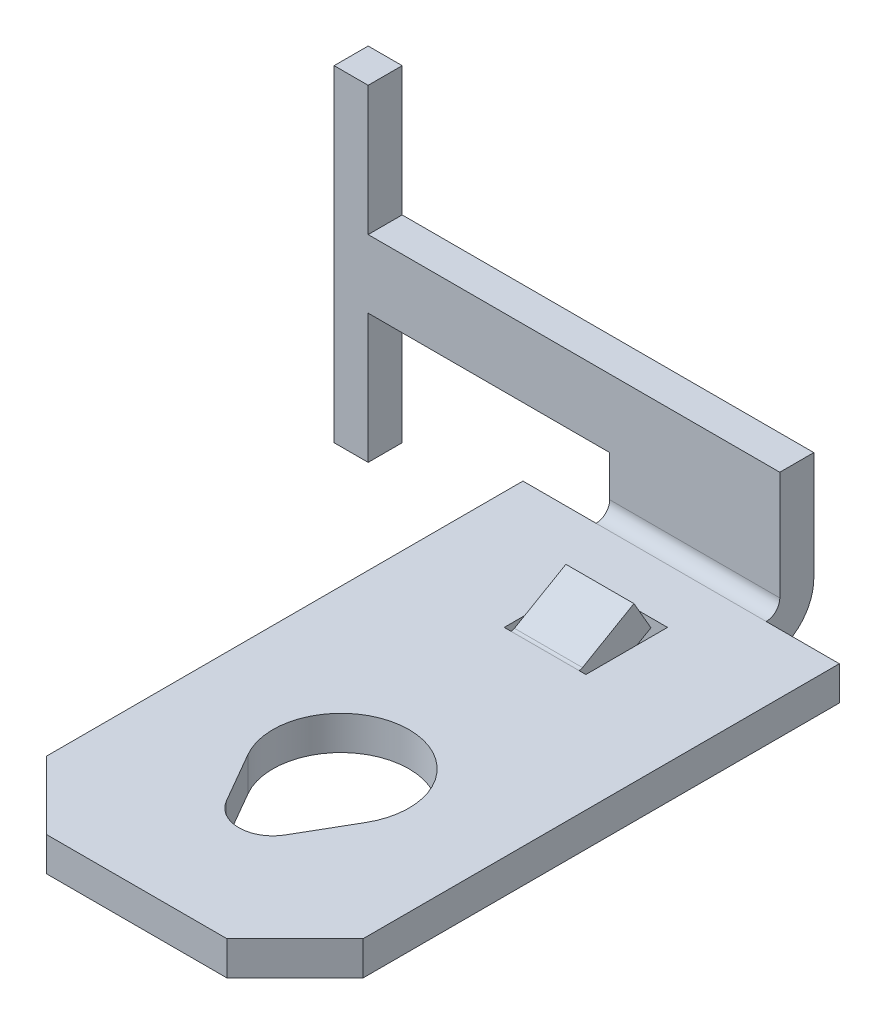
ISO-10303-21;
HEADER;
FILE_DESCRIPTION(('STEP AP214'),'2;1');
FILE_NAME('part.step','',(''),(''),'','','');
FILE_SCHEMA(('AUTOMOTIVE_DESIGN { 1 0 10303 214 1 1 1 1 }'));
ENDSEC;
DATA;
#1=APPLICATION_CONTEXT('core data for automotive mechanical design processes');
#2=APPLICATION_PROTOCOL_DEFINITION('international standard','automotive_design',2000,#1);
#3=PRODUCT_CONTEXT('',#1,'mechanical');
#4=PRODUCT('Part','Part','',(#3));
#5=PRODUCT_RELATED_PRODUCT_CATEGORY('part','',(#4));
#6=PRODUCT_DEFINITION_FORMATION('','',#4);
#7=PRODUCT_DEFINITION_CONTEXT('part definition',#1,'design');
#8=PRODUCT_DEFINITION('design','',#6,#7);
#9=PRODUCT_DEFINITION_SHAPE('','',#8);
#10=(LENGTH_UNIT() NAMED_UNIT(*) SI_UNIT(.MILLI.,.METRE.));
#11=(NAMED_UNIT(*) PLANE_ANGLE_UNIT() SI_UNIT($,.RADIAN.));
#12=(NAMED_UNIT(*) SI_UNIT($,.STERADIAN.) SOLID_ANGLE_UNIT());
#13=UNCERTAINTY_MEASURE_WITH_UNIT(LENGTH_MEASURE(1.E-05),#10,'distance_accuracy_value','');
#14=(GEOMETRIC_REPRESENTATION_CONTEXT(3) GLOBAL_UNCERTAINTY_ASSIGNED_CONTEXT((#13)) GLOBAL_UNIT_ASSIGNED_CONTEXT((#10,
#11,#12)) REPRESENTATION_CONTEXT('',''));
#15=CARTESIAN_POINT('',(0.,0.,0.));
#16=DIRECTION('',(0.,0.,1.));
#17=DIRECTION('',(1.,0.,0.));
#18=AXIS2_PLACEMENT_3D('',#15,#16,#17);
#19=CARTESIAN_POINT('',(0.,-1.29903810567665,-0.776794919243098));
#20=DIRECTION('',(0.,0.866025403784442,0.499999999999995));
#21=DIRECTION('',(0.,-0.499999999999995,0.866025403784442));
#22=AXIS2_PLACEMENT_3D('',#19,#20,#21);
#23=PLANE('',#22);
#24=DIRECTION('',(0.,0.499999999999995,-0.866025403784442));
#25=VECTOR('',#24,1.);
#26=CARTESIAN_POINT('',(-0.5,-0.419615242270665,-2.29999999999999));
#27=LINE('',#26,#25);
#28=CARTESIAN_POINT('',(-0.5,-0.419615242270665,-2.29999999999999));
#29=VERTEX_POINT('',#28);
#30=CARTESIAN_POINT('',(-0.5,0.0169872981077745,-3.0562177826491));
#31=VERTEX_POINT('',#30);
#32=EDGE_CURVE('E252',#29,#31,#27,.T.);
#33=ORIENTED_EDGE('',*,*,#32,.T.);
#34=DIRECTION('',(1.,0.,0.));
#35=VECTOR('',#34,1.);
#36=CARTESIAN_POINT('',(0.5,0.0169872981077746,-3.0562177826491));
#37=LINE('',#36,#35);
#38=CARTESIAN_POINT('',(0.5,0.0169872981077745,-3.0562177826491));
#39=VERTEX_POINT('',#38);
#40=EDGE_CURVE('E338',#31,#39,#37,.T.);
#41=ORIENTED_EDGE('',*,*,#40,.T.);
#42=DIRECTION('',(0.,-0.499999999999995,0.866025403784442));
#43=VECTOR('',#42,1.);
#44=CARTESIAN_POINT('',(0.5,0.0169872981077745,-3.0562177826491));
#45=LINE('',#44,#43);
#46=CARTESIAN_POINT('',(0.5,-0.419615242270665,-2.29999999999999));
#47=VERTEX_POINT('',#46);
#48=EDGE_CURVE('E330',#39,#47,#45,.T.);
#49=ORIENTED_EDGE('',*,*,#48,.T.);
#50=DIRECTION('',(-1.,0.,0.));
#51=VECTOR('',#50,1.);
#52=CARTESIAN_POINT('',(-0.5,-0.419615242270664,-2.29999999999999));
#53=LINE('',#52,#51);
#54=EDGE_CURVE('E305',#29,#47,#53,.F.);
#55=ORIENTED_EDGE('',*,*,#54,.F.);
#56=EDGE_LOOP('',(#33,#41,#49,#55));
#57=FACE_BOUND('',#56,.T.);
#58=ADVANCED_FACE('F17',(#57),#23,.F.);
#59=CARTESIAN_POINT('',(0.,0.,-4.7));
#60=DIRECTION('',(0.,0.,1.));
#61=DIRECTION('',(0.,-1.,0.));
#62=AXIS2_PLACEMENT_3D('',#59,#60,#61);
#63=PLANE('',#62);
#64=DIRECTION('',(0.,1.,0.));
#65=VECTOR('',#64,1.);
#66=CARTESIAN_POINT('',(-1.25,0.799999999999998,-4.7));
#67=LINE('',#66,#65);
#68=CARTESIAN_POINT('',(-1.25,0.2,-4.7));
#69=VERTEX_POINT('',#68);
#70=CARTESIAN_POINT('',(-1.25,0.799999999999998,-4.70000000000001));
#71=VERTEX_POINT('',#70);
#72=EDGE_CURVE('E297',#69,#71,#67,.T.);
#73=ORIENTED_EDGE('',*,*,#72,.T.);
#74=DIRECTION('',(1.,0.,0.));
#75=VECTOR('',#74,1.);
#76=CARTESIAN_POINT('',(-4.8,0.799999999999998,-4.70000000000001));
#77=LINE('',#76,#75);
#78=CARTESIAN_POINT('',(-4.8,0.799999999999998,-4.70000000000001));
#79=VERTEX_POINT('',#78);
#80=EDGE_CURVE('E354',#71,#79,#77,.F.);
#81=ORIENTED_EDGE('',*,*,#80,.T.);
#82=DIRECTION('',(0.,1.,0.));
#83=VECTOR('',#82,1.);
#84=CARTESIAN_POINT('',(-4.8,-1.1,-4.70000000000001));
#85=LINE('',#84,#83);
#86=CARTESIAN_POINT('',(-4.8,-1.1,-4.7));
#87=VERTEX_POINT('',#86);
#88=EDGE_CURVE('E359',#79,#87,#85,.F.);
#89=ORIENTED_EDGE('',*,*,#88,.T.);
#90=DIRECTION('',(1.,0.,0.));
#91=VECTOR('',#90,1.);
#92=CARTESIAN_POINT('',(-5.3,-1.1,-4.7));
#93=LINE('',#92,#91);
#94=CARTESIAN_POINT('',(-5.3,-1.1,-4.7));
#95=VERTEX_POINT('',#94);
#96=EDGE_CURVE('E367',#87,#95,#93,.F.);
#97=ORIENTED_EDGE('',*,*,#96,.T.);
#98=DIRECTION('',(0.,1.,0.));
#99=VECTOR('',#98,1.);
#100=CARTESIAN_POINT('',(-5.3,3.7,-4.7));
#101=LINE('',#100,#99);
#102=CARTESIAN_POINT('',(-5.3,3.7,-4.70000000000001));
#103=VERTEX_POINT('',#102);
#104=EDGE_CURVE('E375',#95,#103,#101,.T.);
#105=ORIENTED_EDGE('',*,*,#104,.T.);
#106=DIRECTION('',(1.,0.,0.));
#107=VECTOR('',#106,1.);
#108=CARTESIAN_POINT('',(-4.8,3.7,-4.70000000000002));
#109=LINE('',#108,#107);
#110=CARTESIAN_POINT('',(-4.8,3.7,-4.70000000000002));
#111=VERTEX_POINT('',#110);
#112=EDGE_CURVE('E383',#103,#111,#109,.T.);
#113=ORIENTED_EDGE('',*,*,#112,.T.);
#114=DIRECTION('',(0.,1.,0.));
#115=VECTOR('',#114,1.);
#116=CARTESIAN_POINT('',(-4.8,1.8,-4.70000000000002));
#117=LINE('',#116,#115);
#118=CARTESIAN_POINT('',(-4.8,1.8,-4.70000000000001));
#119=VERTEX_POINT('',#118);
#120=EDGE_CURVE('E315',#111,#119,#117,.F.);
#121=ORIENTED_EDGE('',*,*,#120,.T.);
#122=DIRECTION('',(1.,0.,0.));
#123=VECTOR('',#122,1.);
#124=CARTESIAN_POINT('',(1.25,1.8,-4.70000000000001));
#125=LINE('',#124,#123);
#126=CARTESIAN_POINT('',(1.25,1.8,-4.70000000000001));
#127=VERTEX_POINT('',#126);
#128=EDGE_CURVE('E316',#119,#127,#125,.T.);
#129=ORIENTED_EDGE('',*,*,#128,.T.);
#130=DIRECTION('',(0.,1.,0.));
#131=VECTOR('',#130,1.);
#132=CARTESIAN_POINT('',(1.25,0.,-4.70000000000001));
#133=LINE('',#132,#131);
#134=CARTESIAN_POINT('',(1.25,0.199999999999999,-4.70000000000001));
#135=VERTEX_POINT('',#134);
#136=EDGE_CURVE('E332',#127,#135,#133,.F.);
#137=ORIENTED_EDGE('',*,*,#136,.T.);
#138=DIRECTION('',(-1.,0.,0.));
#139=VECTOR('',#138,1.);
#140=CARTESIAN_POINT('',(-1.25,0.200000000000003,-4.7));
#141=LINE('',#140,#139);
#142=EDGE_CURVE('E254',#69,#135,#141,.F.);
#143=ORIENTED_EDGE('',*,*,#142,.F.);
#144=EDGE_LOOP('',(#73,#81,#89,#97,#105,#113,#121,#129,#137,#143));
#145=FACE_BOUND('',#144,.T.);
#146=ADVANCED_FACE('F648',(#145),#63,.F.);
#147=CARTESIAN_POINT('',(0.5,0.0169872981077745,-3.0562177826491));
#148=DIRECTION('',(0.,-0.499999999999995,0.866025403784442));
#149=DIRECTION('',(0.,-0.866025403784442,-0.499999999999995));
#150=AXIS2_PLACEMENT_3D('',#147,#148,#149);
#151=PLANE('',#150);
#152=DIRECTION('',(0.,-0.866025403784441,-0.499999999999995));
#153=VECTOR('',#152,1.);
#154=CARTESIAN_POINT('',(0.5,0.449999999999995,-2.80621778264911));
#155=LINE('',#154,#153);
#156=CARTESIAN_POINT('',(0.5,0.449999999999995,-2.80621778264911));
#157=VERTEX_POINT('',#156);
#158=EDGE_CURVE('E333',#157,#39,#155,.T.);
#159=ORIENTED_EDGE('',*,*,#158,.T.);
#160=ORIENTED_EDGE('',*,*,#40,.F.);
#161=DIRECTION('',(0.,-0.866025403784442,-0.499999999999995));
#162=VECTOR('',#161,1.);
#163=CARTESIAN_POINT('',(-0.5,0.0169872981077743,-3.0562177826491));
#164=LINE('',#163,#162);
#165=CARTESIAN_POINT('',(-0.5,0.449999999999995,-2.80621778264911));
#166=VERTEX_POINT('',#165);
#167=EDGE_CURVE('E347',#166,#31,#164,.T.);
#168=ORIENTED_EDGE('',*,*,#167,.F.);
#169=DIRECTION('',(1.,0.,0.));
#170=VECTOR('',#169,1.);
#171=CARTESIAN_POINT('',(0.,0.449999999999995,-2.80621778264911));
#172=LINE('',#171,#170);
#173=EDGE_CURVE('E341',#157,#166,#172,.F.);
#174=ORIENTED_EDGE('',*,*,#173,.F.);
#175=EDGE_LOOP('',(#159,#160,#168,#174));
#176=FACE_BOUND('',#175,.T.);
#177=ADVANCED_FACE('F654',(#176),#151,.F.);
#178=CARTESIAN_POINT('',(1.25,1.8,-4.70000000000001));
#179=DIRECTION('',(0.,-1.,0.));
#180=DIRECTION('',(0.,0.,-1.));
#181=AXIS2_PLACEMENT_3D('',#178,#179,#180);
#182=PLANE('',#181);
#183=DIRECTION('',(0.,0.,-1.));
#184=VECTOR('',#183,1.);
#185=CARTESIAN_POINT('',(1.25,1.8,-4.70000000000001));
#186=LINE('',#185,#184);
#187=CARTESIAN_POINT('',(1.25,1.8,-4.20000000000001));
#188=VERTEX_POINT('',#187);
#189=EDGE_CURVE('E313',#127,#188,#186,.F.);
#190=ORIENTED_EDGE('',*,*,#189,.F.);
#191=ORIENTED_EDGE('',*,*,#128,.F.);
#192=DIRECTION('',(0.,0.,1.));
#193=VECTOR('',#192,1.);
#194=CARTESIAN_POINT('',(-4.8,1.8,-4.70000000000001));
#195=LINE('',#194,#193);
#196=CARTESIAN_POINT('',(-4.8,1.8,-4.20000000000001));
#197=VERTEX_POINT('',#196);
#198=EDGE_CURVE('E385',#119,#197,#195,.T.);
#199=ORIENTED_EDGE('',*,*,#198,.T.);
#200=DIRECTION('',(1.,0.,0.));
#201=VECTOR('',#200,1.);
#202=CARTESIAN_POINT('',(0.,1.8,-4.20000000000001));
#203=LINE('',#202,#201);
#204=EDGE_CURVE('E306',#188,#197,#203,.F.);
#205=ORIENTED_EDGE('',*,*,#204,.F.);
#206=EDGE_LOOP('',(#190,#191,#199,#205));
#207=FACE_BOUND('',#206,.T.);
#208=ADVANCED_FACE('F652',(#207),#182,.F.);
#209=CARTESIAN_POINT('',(-4.8,1.8,-4.70000000000001));
#210=DIRECTION('',(-1.,0.,0.));
#211=DIRECTION('',(0.,0.,1.));
#212=AXIS2_PLACEMENT_3D('',#209,#210,#211);
#213=PLANE('',#212);
#214=ORIENTED_EDGE('',*,*,#198,.F.);
#215=ORIENTED_EDGE('',*,*,#120,.F.);
#216=DIRECTION('',(0.,0.,-1.));
#217=VECTOR('',#216,1.);
#218=CARTESIAN_POINT('',(-4.8,3.7,-4.70000000000002));
#219=LINE('',#218,#217);
#220=CARTESIAN_POINT('',(-4.8,3.7,-4.20000000000001));
#221=VERTEX_POINT('',#220);
#222=EDGE_CURVE('E377',#111,#221,#219,.F.);
#223=ORIENTED_EDGE('',*,*,#222,.T.);
#224=DIRECTION('',(0.,-1.,0.));
#225=VECTOR('',#224,1.);
#226=CARTESIAN_POINT('',(-4.8,0.,-4.2));
#227=LINE('',#226,#225);
#228=EDGE_CURVE('E309',#197,#221,#227,.F.);
#229=ORIENTED_EDGE('',*,*,#228,.F.);
#230=EDGE_LOOP('',(#214,#215,#223,#229));
#231=FACE_BOUND('',#230,.T.);
#232=ADVANCED_FACE('F587',(#231),#213,.F.);
#233=CARTESIAN_POINT('',(-4.8,3.7,-4.70000000000002));
#234=DIRECTION('',(0.,-1.,0.));
#235=DIRECTION('',(0.,0.,-1.));
#236=AXIS2_PLACEMENT_3D('',#233,#234,#235);
#237=PLANE('',#236);
#238=ORIENTED_EDGE('',*,*,#222,.F.);
#239=ORIENTED_EDGE('',*,*,#112,.F.);
#240=DIRECTION('',(0.,0.,1.));
#241=VECTOR('',#240,1.);
#242=CARTESIAN_POINT('',(-5.3,3.7,-4.70000000000002));
#243=LINE('',#242,#241);
#244=CARTESIAN_POINT('',(-5.3,3.7,-4.20000000000002));
#245=VERTEX_POINT('',#244);
#246=EDGE_CURVE('E369',#103,#245,#243,.T.);
#247=ORIENTED_EDGE('',*,*,#246,.T.);
#248=DIRECTION('',(1.,0.,0.));
#249=VECTOR('',#248,1.);
#250=CARTESIAN_POINT('',(0.,3.7,-4.20000000000002));
#251=LINE('',#250,#249);
#252=EDGE_CURVE('E577',#221,#245,#251,.F.);
#253=ORIENTED_EDGE('',*,*,#252,.F.);
#254=EDGE_LOOP('',(#238,#239,#247,#253));
#255=FACE_BOUND('',#254,.T.);
#256=ADVANCED_FACE('F592',(#255),#237,.F.);
#257=CARTESIAN_POINT('',(-5.3,3.7,-4.70000000000002));
#258=DIRECTION('',(1.,0.,0.));
#259=DIRECTION('',(0.,1.,0.));
#260=AXIS2_PLACEMENT_3D('',#257,#258,#259);
#261=PLANE('',#260);
#262=ORIENTED_EDGE('',*,*,#246,.F.);
#263=ORIENTED_EDGE('',*,*,#104,.F.);
#264=DIRECTION('',(0.,0.,1.));
#265=VECTOR('',#264,1.);
#266=CARTESIAN_POINT('',(-5.3,-1.1,-4.7));
#267=LINE('',#266,#265);
#268=CARTESIAN_POINT('',(-5.3,-1.1,-4.20000000000001));
#269=VERTEX_POINT('',#268);
#270=EDGE_CURVE('E361',#95,#269,#267,.T.);
#271=ORIENTED_EDGE('',*,*,#270,.T.);
#272=DIRECTION('',(0.,-1.,0.));
#273=VECTOR('',#272,1.);
#274=CARTESIAN_POINT('',(-5.3,0.,-4.2));
#275=LINE('',#274,#273);
#276=EDGE_CURVE('E574',#245,#269,#275,.T.);
#277=ORIENTED_EDGE('',*,*,#276,.F.);
#278=EDGE_LOOP('',(#262,#263,#271,#277));
#279=FACE_BOUND('',#278,.T.);
#280=ADVANCED_FACE('F597',(#279),#261,.F.);
#281=CARTESIAN_POINT('',(-5.3,-1.1,-4.7));
#282=DIRECTION('',(0.,1.,0.));
#283=DIRECTION('',(0.,0.,1.));
#284=AXIS2_PLACEMENT_3D('',#281,#282,#283);
#285=PLANE('',#284);
#286=ORIENTED_EDGE('',*,*,#270,.F.);
#287=ORIENTED_EDGE('',*,*,#96,.F.);
#288=DIRECTION('',(0.,0.,1.));
#289=VECTOR('',#288,1.);
#290=CARTESIAN_POINT('',(-4.8,-1.1,-4.7));
#291=LINE('',#290,#289);
#292=CARTESIAN_POINT('',(-4.8,-1.1,-4.2));
#293=VERTEX_POINT('',#292);
#294=EDGE_CURVE('E356',#87,#293,#291,.T.);
#295=ORIENTED_EDGE('',*,*,#294,.T.);
#296=DIRECTION('',(1.,0.,0.));
#297=VECTOR('',#296,1.);
#298=CARTESIAN_POINT('',(0.,-1.1,-4.2));
#299=LINE('',#298,#297);
#300=EDGE_CURVE('E571',#269,#293,#299,.T.);
#301=ORIENTED_EDGE('',*,*,#300,.F.);
#302=EDGE_LOOP('',(#286,#287,#295,#301));
#303=FACE_BOUND('',#302,.T.);
#304=ADVANCED_FACE('F602',(#303),#285,.F.);
#305=CARTESIAN_POINT('',(-4.8,-1.1,-4.7));
#306=DIRECTION('',(-1.,0.,0.));
#307=DIRECTION('',(0.,0.,1.));
#308=AXIS2_PLACEMENT_3D('',#305,#306,#307);
#309=PLANE('',#308);
#310=ORIENTED_EDGE('',*,*,#294,.F.);
#311=ORIENTED_EDGE('',*,*,#88,.F.);
#312=DIRECTION('',(0.,0.,1.));
#313=VECTOR('',#312,1.);
#314=CARTESIAN_POINT('',(-4.8,0.799999999999998,-4.70000000000001));
#315=LINE('',#314,#313);
#316=CARTESIAN_POINT('',(-4.8,0.8,-4.2));
#317=VERTEX_POINT('',#316);
#318=EDGE_CURVE('E300',#79,#317,#315,.T.);
#319=ORIENTED_EDGE('',*,*,#318,.T.);
#320=DIRECTION('',(0.,-1.,0.));
#321=VECTOR('',#320,1.);
#322=CARTESIAN_POINT('',(-4.8,0.,-4.2));
#323=LINE('',#322,#321);
#324=EDGE_CURVE('E326',#293,#317,#323,.F.);
#325=ORIENTED_EDGE('',*,*,#324,.F.);
#326=EDGE_LOOP('',(#310,#311,#319,#325));
#327=FACE_BOUND('',#326,.T.);
#328=ADVANCED_FACE('F607',(#327),#309,.F.);
#329=CARTESIAN_POINT('',(-4.8,0.799999999999998,-4.70000000000001));
#330=DIRECTION('',(0.,1.,0.));
#331=DIRECTION('',(0.,0.,1.));
#332=AXIS2_PLACEMENT_3D('',#329,#330,#331);
#333=PLANE('',#332);
#334=ORIENTED_EDGE('',*,*,#318,.F.);
#335=ORIENTED_EDGE('',*,*,#80,.F.);
#336=DIRECTION('',(0.,0.,-1.));
#337=VECTOR('',#336,1.);
#338=CARTESIAN_POINT('',(-1.25,0.799999999999998,-4.70000000000001));
#339=LINE('',#338,#337);
#340=CARTESIAN_POINT('',(-1.25,0.799999999999999,-4.20000000000001));
#341=VERTEX_POINT('',#340);
#342=EDGE_CURVE('E299',#71,#341,#339,.F.);
#343=ORIENTED_EDGE('',*,*,#342,.T.);
#344=DIRECTION('',(1.,0.,0.));
#345=VECTOR('',#344,1.);
#346=CARTESIAN_POINT('',(0.,0.8,-4.20000000000001));
#347=LINE('',#346,#345);
#348=EDGE_CURVE('E322',#317,#341,#347,.T.);
#349=ORIENTED_EDGE('',*,*,#348,.F.);
#350=EDGE_LOOP('',(#334,#335,#343,#349));
#351=FACE_BOUND('',#350,.T.);
#352=ADVANCED_FACE('F612',(#351),#333,.F.);
#353=CARTESIAN_POINT('',(-0.5,0.100000000000001,-2.));
#354=DIRECTION('',(-1.,0.,0.));
#355=DIRECTION('',(0.,-1.,0.));
#356=AXIS2_PLACEMENT_3D('',#353,#354,#355);
#357=CYLINDRICAL_SURFACE('',#356,0.6);
#358=ORIENTED_EDGE('',*,*,#54,.T.);
#359=CARTESIAN_POINT('',(0.5,0.1,-2.));
#360=DIRECTION('',(-1.,0.,0.));
#361=DIRECTION('',(0.,-1.,0.));
#362=AXIS2_PLACEMENT_3D('',#359,#360,#361);
#363=CIRCLE('',#362,0.6);
#364=CARTESIAN_POINT('',(0.5,-0.5,-2.));
#365=VERTEX_POINT('',#364);
#366=EDGE_CURVE('E231',#365,#47,#363,.F.);
#367=ORIENTED_EDGE('',*,*,#366,.F.);
#368=DIRECTION('',(1.,0.,0.));
#369=VECTOR('',#368,1.);
#370=CARTESIAN_POINT('',(0.,-0.5,-2.));
#371=LINE('',#370,#369);
#372=CARTESIAN_POINT('',(-0.5,-0.5,-2.));
#373=VERTEX_POINT('',#372);
#374=EDGE_CURVE('E224',#365,#373,#371,.F.);
#375=ORIENTED_EDGE('',*,*,#374,.T.);
#376=CARTESIAN_POINT('',(-0.5,0.100000000000001,-2.));
#377=DIRECTION('',(-1.,0.,0.));
#378=DIRECTION('',(0.,-1.,0.));
#379=AXIS2_PLACEMENT_3D('',#376,#377,#378);
#380=CIRCLE('',#379,0.6);
#381=EDGE_CURVE('E20',#373,#29,#380,.F.);
#382=ORIENTED_EDGE('',*,*,#381,.T.);
#383=EDGE_LOOP('',(#358,#367,#375,#382));
#384=FACE_BOUND('',#383,.T.);
#385=ADVANCED_FACE('F227',(#384),#357,.T.);
#386=CARTESIAN_POINT('',(-1.25,0.199999999999998,-4.));
#387=DIRECTION('',(-1.,0.,0.));
#388=DIRECTION('',(0.,0.,1.));
#389=AXIS2_PLACEMENT_3D('',#386,#387,#388);
#390=CYLINDRICAL_SURFACE('',#389,0.700000000000001);
#391=ORIENTED_EDGE('',*,*,#142,.T.);
#392=CARTESIAN_POINT('',(1.25,0.199999999999998,-4.));
#393=DIRECTION('',(-1.,0.,0.));
#394=DIRECTION('',(0.,0.,1.));
#395=AXIS2_PLACEMENT_3D('',#392,#393,#394);
#396=CIRCLE('',#395,0.700000000000001);
#397=CARTESIAN_POINT('',(1.25,-0.500000000000002,-4.));
#398=VERTEX_POINT('',#397);
#399=EDGE_CURVE('E325',#398,#135,#396,.F.);
#400=ORIENTED_EDGE('',*,*,#399,.F.);
#401=DIRECTION('',(1.,0.,0.));
#402=VECTOR('',#401,1.);
#403=CARTESIAN_POINT('',(0.,-0.5,-4.));
#404=LINE('',#403,#402);
#405=CARTESIAN_POINT('',(-1.25,-0.500000000000002,-4.));
#406=VERTEX_POINT('',#405);
#407=EDGE_CURVE('E234',#398,#406,#404,.F.);
#408=ORIENTED_EDGE('',*,*,#407,.T.);
#409=CARTESIAN_POINT('',(-1.25,0.199999999999998,-4.));
#410=DIRECTION('',(-1.,0.,0.));
#411=DIRECTION('',(0.,0.,1.));
#412=AXIS2_PLACEMENT_3D('',#409,#410,#411);
#413=CIRCLE('',#412,0.700000000000001);
#414=EDGE_CURVE('E235',#406,#69,#413,.F.);
#415=ORIENTED_EDGE('',*,*,#414,.T.);
#416=EDGE_LOOP('',(#391,#400,#408,#415));
#417=FACE_BOUND('',#416,.T.);
#418=ADVANCED_FACE('F646',(#417),#390,.T.);
#419=CARTESIAN_POINT('',(-0.5,0.100000000000001,-2.));
#420=DIRECTION('',(1.,0.,0.));
#421=DIRECTION('',(0.,1.,0.));
#422=AXIS2_PLACEMENT_3D('',#419,#420,#421);
#423=PLANE('',#422);
#424=CARTESIAN_POINT('',(-0.5,0.100000000000001,-2.));
#425=DIRECTION('',(-1.,0.,0.));
#426=DIRECTION('',(0.,-1.,0.));
#427=AXIS2_PLACEMENT_3D('',#424,#425,#426);
#428=CIRCLE('',#427,0.1);
#429=CARTESIAN_POINT('',(-0.5,0.,-2.));
#430=VERTEX_POINT('',#429);
#431=CARTESIAN_POINT('',(-0.5,0.0133974596215563,-2.05));
#432=VERTEX_POINT('',#431);
#433=EDGE_CURVE('E434',#430,#432,#428,.F.);
#434=ORIENTED_EDGE('',*,*,#433,.T.);
#435=DIRECTION('',(0.,-0.499999999999995,0.866025403784442));
#436=VECTOR('',#435,1.);
#437=CARTESIAN_POINT('',(-0.5,-0.866025403784431,-0.526794919243101));
#438=LINE('',#437,#436);
#439=EDGE_CURVE('E253',#166,#432,#438,.T.);
#440=ORIENTED_EDGE('',*,*,#439,.F.);
#441=ORIENTED_EDGE('',*,*,#167,.T.);
#442=ORIENTED_EDGE('',*,*,#32,.F.);
#443=ORIENTED_EDGE('',*,*,#381,.F.);
#444=DIRECTION('',(0.,1.,0.));
#445=VECTOR('',#444,1.);
#446=CARTESIAN_POINT('',(-0.5,-1.1,-2.));
#447=LINE('',#446,#445);
#448=EDGE_CURVE('E245',#373,#430,#447,.T.);
#449=ORIENTED_EDGE('',*,*,#448,.T.);
#450=EDGE_LOOP('',(#434,#440,#441,#442,#443,#449));
#451=FACE_BOUND('',#450,.T.);
#452=ADVANCED_FACE('F249',(#451),#423,.F.);
#453=CARTESIAN_POINT('',(0.,-0.866025403784431,-0.526794919243101));
#454=DIRECTION('',(0.,0.866025403784442,0.499999999999995));
#455=DIRECTION('',(0.,-0.499999999999995,0.866025403784442));
#456=AXIS2_PLACEMENT_3D('',#453,#454,#455);
#457=PLANE('',#456);
#458=DIRECTION('',(0.,-0.499999999999995,0.866025403784442));
#459=VECTOR('',#458,1.);
#460=CARTESIAN_POINT('',(0.5,-0.866025403784431,-0.526794919243101));
#461=LINE('',#460,#459);
#462=CARTESIAN_POINT('',(0.5,0.0133974596215558,-2.05));
#463=VERTEX_POINT('',#462);
#464=EDGE_CURVE('E344',#463,#157,#461,.F.);
#465=ORIENTED_EDGE('',*,*,#464,.T.);
#466=ORIENTED_EDGE('',*,*,#173,.T.);
#467=ORIENTED_EDGE('',*,*,#439,.T.);
#468=DIRECTION('',(-1.,0.,0.));
#469=VECTOR('',#468,1.);
#470=CARTESIAN_POINT('',(-0.5,0.0133974596215566,-2.05));
#471=LINE('',#470,#469);
#472=EDGE_CURVE('E433',#432,#463,#471,.F.);
#473=ORIENTED_EDGE('',*,*,#472,.T.);
#474=EDGE_LOOP('',(#465,#466,#467,#473));
#475=FACE_BOUND('',#474,.T.);
#476=ADVANCED_FACE('F479',(#475),#457,.T.);
#477=CARTESIAN_POINT('',(0.5,0.1,-2.));
#478=DIRECTION('',(1.,0.,0.));
#479=DIRECTION('',(0.,1.,0.));
#480=AXIS2_PLACEMENT_3D('',#477,#478,#479);
#481=PLANE('',#480);
#482=DIRECTION('',(0.,1.,0.));
#483=VECTOR('',#482,1.);
#484=CARTESIAN_POINT('',(0.5,-1.1,-2.));
#485=LINE('',#484,#483);
#486=CARTESIAN_POINT('',(0.5,0.,-2.));
#487=VERTEX_POINT('',#486);
#488=EDGE_CURVE('E277',#487,#365,#485,.F.);
#489=ORIENTED_EDGE('',*,*,#488,.T.);
#490=ORIENTED_EDGE('',*,*,#366,.T.);
#491=ORIENTED_EDGE('',*,*,#48,.F.);
#492=ORIENTED_EDGE('',*,*,#158,.F.);
#493=ORIENTED_EDGE('',*,*,#464,.F.);
#494=CARTESIAN_POINT('',(0.5,0.1,-2.));
#495=DIRECTION('',(-1.,0.,0.));
#496=DIRECTION('',(0.,-1.,0.));
#497=AXIS2_PLACEMENT_3D('',#494,#495,#496);
#498=CIRCLE('',#497,0.1);
#499=EDGE_CURVE('E431',#463,#487,#498,.T.);
#500=ORIENTED_EDGE('',*,*,#499,.T.);
#501=EDGE_LOOP('',(#489,#490,#491,#492,#493,#500));
#502=FACE_BOUND('',#501,.T.);
#503=ADVANCED_FACE('F487',(#502),#481,.T.);
#504=CARTESIAN_POINT('',(0.,0.,-4.2));
#505=DIRECTION('',(0.,0.,1.));
#506=DIRECTION('',(0.,-1.,0.));
#507=AXIS2_PLACEMENT_3D('',#504,#505,#506);
#508=PLANE('',#507);
#509=ORIENTED_EDGE('',*,*,#324,.T.);
#510=ORIENTED_EDGE('',*,*,#348,.T.);
#511=DIRECTION('',(0.,-1.,0.));
#512=VECTOR('',#511,1.);
#513=CARTESIAN_POINT('',(-1.25,0.,-4.2));
#514=LINE('',#513,#512);
#515=CARTESIAN_POINT('',(-1.25,0.2,-4.2));
#516=VERTEX_POINT('',#515);
#517=EDGE_CURVE('E439',#341,#516,#514,.T.);
#518=ORIENTED_EDGE('',*,*,#517,.T.);
#519=DIRECTION('',(-1.,0.,0.));
#520=VECTOR('',#519,1.);
#521=CARTESIAN_POINT('',(-1.25,0.199999999999997,-4.2));
#522=LINE('',#521,#520);
#523=CARTESIAN_POINT('',(1.25,0.199999999999996,-4.2));
#524=VERTEX_POINT('',#523);
#525=EDGE_CURVE('E420',#516,#524,#522,.F.);
#526=ORIENTED_EDGE('',*,*,#525,.T.);
#527=DIRECTION('',(0.,-1.,0.));
#528=VECTOR('',#527,1.);
#529=CARTESIAN_POINT('',(1.25,0.,-4.2));
#530=LINE('',#529,#528);
#531=EDGE_CURVE('E310',#524,#188,#530,.F.);
#532=ORIENTED_EDGE('',*,*,#531,.T.);
#533=ORIENTED_EDGE('',*,*,#204,.T.);
#534=ORIENTED_EDGE('',*,*,#228,.T.);
#535=ORIENTED_EDGE('',*,*,#252,.T.);
#536=ORIENTED_EDGE('',*,*,#276,.T.);
#537=ORIENTED_EDGE('',*,*,#300,.T.);
#538=EDGE_LOOP('',(#509,#510,#518,#526,#532,#533,#534,#535,#536,#537));
#539=FACE_BOUND('',#538,.T.);
#540=ADVANCED_FACE('F582',(#539),#508,.T.);
#541=CARTESIAN_POINT('',(1.25,0.199999999999998,-4.));
#542=DIRECTION('',(1.,0.,0.));
#543=DIRECTION('',(0.,0.,-1.));
#544=AXIS2_PLACEMENT_3D('',#541,#542,#543);
#545=PLANE('',#544);
#546=DIRECTION('',(0.,1.,0.));
#547=VECTOR('',#546,1.);
#548=CARTESIAN_POINT('',(1.25,-0.5,-4.));
#549=LINE('',#548,#547);
#550=CARTESIAN_POINT('',(1.25,0.,-4.));
#551=VERTEX_POINT('',#550);
#552=EDGE_CURVE('E530',#398,#551,#549,.T.);
#553=ORIENTED_EDGE('',*,*,#552,.F.);
#554=ORIENTED_EDGE('',*,*,#399,.T.);
#555=ORIENTED_EDGE('',*,*,#136,.F.);
#556=ORIENTED_EDGE('',*,*,#189,.T.);
#557=ORIENTED_EDGE('',*,*,#531,.F.);
#558=CARTESIAN_POINT('',(1.25,0.199999999999998,-4.));
#559=DIRECTION('',(-1.,0.,0.));
#560=DIRECTION('',(0.,0.,1.));
#561=AXIS2_PLACEMENT_3D('',#558,#559,#560);
#562=CIRCLE('',#561,0.200000000000001);
#563=EDGE_CURVE('E417',#524,#551,#562,.T.);
#564=ORIENTED_EDGE('',*,*,#563,.T.);
#565=EDGE_LOOP('',(#553,#554,#555,#556,#557,#564));
#566=FACE_BOUND('',#565,.T.);
#567=ADVANCED_FACE('F639',(#566),#545,.T.);
#568=CARTESIAN_POINT('',(-1.25,0.199999999999998,-4.));
#569=DIRECTION('',(1.,0.,0.));
#570=DIRECTION('',(0.,0.,-1.));
#571=AXIS2_PLACEMENT_3D('',#568,#569,#570);
#572=PLANE('',#571);
#573=CARTESIAN_POINT('',(-1.25,0.199999999999998,-4.));
#574=DIRECTION('',(-1.,0.,0.));
#575=DIRECTION('',(0.,0.,1.));
#576=AXIS2_PLACEMENT_3D('',#573,#574,#575);
#577=CIRCLE('',#576,0.200000000000001);
#578=CARTESIAN_POINT('',(-1.25,0.,-4.));
#579=VERTEX_POINT('',#578);
#580=EDGE_CURVE('E421',#579,#516,#577,.F.);
#581=ORIENTED_EDGE('',*,*,#580,.T.);
#582=ORIENTED_EDGE('',*,*,#517,.F.);
#583=ORIENTED_EDGE('',*,*,#342,.F.);
#584=ORIENTED_EDGE('',*,*,#72,.F.);
#585=ORIENTED_EDGE('',*,*,#414,.F.);
#586=DIRECTION('',(0.,1.,0.));
#587=VECTOR('',#586,1.);
#588=CARTESIAN_POINT('',(-1.25,-0.5,-4.));
#589=LINE('',#588,#587);
#590=EDGE_CURVE('E419',#579,#406,#589,.F.);
#591=ORIENTED_EDGE('',*,*,#590,.F.);
#592=EDGE_LOOP('',(#581,#582,#583,#584,#585,#591));
#593=FACE_BOUND('',#592,.T.);
#594=ADVANCED_FACE('F616',(#593),#572,.F.);
#595=CARTESIAN_POINT('',(0.,-0.5,0.));
#596=DIRECTION('',(0.,1.,0.));
#597=DIRECTION('',(0.,0.,1.));
#598=AXIS2_PLACEMENT_3D('',#595,#596,#597);
#599=PLANE('',#598);
#600=DIRECTION('',(-0.707106781186546,0.,0.707106781186549));
#601=VECTOR('',#600,1.);
#602=CARTESIAN_POINT('',(1.325,-0.5,4.));
#603=LINE('',#602,#601);
#604=CARTESIAN_POINT('',(2.32500000000001,-0.5,3.));
#605=VERTEX_POINT('',#604);
#606=CARTESIAN_POINT('',(1.325,-0.5,4.));
#607=VERTEX_POINT('',#606);
#608=EDGE_CURVE('E536',#605,#607,#603,.T.);
#609=ORIENTED_EDGE('',*,*,#608,.T.);
#610=DIRECTION('',(1.,0.,0.));
#611=VECTOR('',#610,1.);
#612=CARTESIAN_POINT('',(2.32500000000001,-0.5,4.));
#613=LINE('',#612,#611);
#614=CARTESIAN_POINT('',(-1.32499999999999,-0.5,4.));
#615=VERTEX_POINT('',#614);
#616=EDGE_CURVE('E541',#615,#607,#613,.T.);
#617=ORIENTED_EDGE('',*,*,#616,.F.);
#618=DIRECTION('',(0.707106781186549,0.,0.707106781186546));
#619=VECTOR('',#618,1.);
#620=CARTESIAN_POINT('',(-2.32499999999999,-0.5,3.));
#621=LINE('',#620,#619);
#622=CARTESIAN_POINT('',(-2.325,-0.5,3.));
#623=VERTEX_POINT('',#622);
#624=EDGE_CURVE('E246',#623,#615,#621,.T.);
#625=ORIENTED_EDGE('',*,*,#624,.F.);
#626=DIRECTION('',(0.,0.,1.));
#627=VECTOR('',#626,1.);
#628=CARTESIAN_POINT('',(-2.32499999999999,-0.5,4.));
#629=LINE('',#628,#627);
#630=CARTESIAN_POINT('',(-2.32499999999999,-0.5,-4.));
#631=VERTEX_POINT('',#630);
#632=EDGE_CURVE('E525',#631,#623,#629,.T.);
#633=ORIENTED_EDGE('',*,*,#632,.F.);
#634=DIRECTION('',(-1.,0.,0.));
#635=VECTOR('',#634,1.);
#636=CARTESIAN_POINT('',(2.32500000000001,-0.5,-4.));
#637=LINE('',#636,#635);
#638=EDGE_CURVE('E527',#406,#631,#637,.T.);
#639=ORIENTED_EDGE('',*,*,#638,.F.);
#640=ORIENTED_EDGE('',*,*,#407,.F.);
#641=DIRECTION('',(-1.,0.,0.));
#642=VECTOR('',#641,1.);
#643=CARTESIAN_POINT('',(2.32500000000001,-0.5,-4.));
#644=LINE('',#643,#642);
#645=CARTESIAN_POINT('',(2.32500000000001,-0.5,-4.));
#646=VERTEX_POINT('',#645);
#647=EDGE_CURVE('E423',#646,#398,#644,.T.);
#648=ORIENTED_EDGE('',*,*,#647,.F.);
#649=DIRECTION('',(0.,0.,-1.));
#650=VECTOR('',#649,1.);
#651=CARTESIAN_POINT('',(2.32500000000001,-0.5,4.));
#652=LINE('',#651,#650);
#653=EDGE_CURVE('E531',#605,#646,#652,.T.);
#654=ORIENTED_EDGE('',*,*,#653,.F.);
#655=EDGE_LOOP('',(#609,#617,#625,#633,#639,#640,#648,#654));
#656=FACE_BOUND('',#655,.T.);
#657=CARTESIAN_POINT('',(0.,-0.5,1.));
#658=DIRECTION('',(0.,1.,0.));
#659=DIRECTION('',(0.,0.,1.));
#660=AXIS2_PLACEMENT_3D('',#657,#658,#659);
#661=CIRCLE('',#660,1.);
#662=CARTESIAN_POINT('',(0.866025403784439,-0.5,1.5));
#663=VERTEX_POINT('',#662);
#664=CARTESIAN_POINT('',(-0.866025403784439,-0.5,1.5));
#665=VERTEX_POINT('',#664);
#666=EDGE_CURVE('E428',#663,#665,#661,.T.);
#667=ORIENTED_EDGE('',*,*,#666,.T.);
#668=DIRECTION('',(0.5,0.,0.866025403784439));
#669=VECTOR('',#668,1.);
#670=CARTESIAN_POINT('',(-0.866025403784439,-0.5,1.5));
#671=LINE('',#670,#669);
#672=CARTESIAN_POINT('',(-0.43301270189222,-0.5,2.25));
#673=VERTEX_POINT('',#672);
#674=EDGE_CURVE('E426',#665,#673,#671,.T.);
#675=ORIENTED_EDGE('',*,*,#674,.T.);
#676=CARTESIAN_POINT('',(0.,-0.5,2.));
#677=DIRECTION('',(0.,1.,0.));
#678=DIRECTION('',(0.,0.,1.));
#679=AXIS2_PLACEMENT_3D('',#676,#677,#678);
#680=CIRCLE('',#679,0.5);
#681=CARTESIAN_POINT('',(0.433012701892219,-0.5,2.25));
#682=VERTEX_POINT('',#681);
#683=EDGE_CURVE('E424',#673,#682,#680,.T.);
#684=ORIENTED_EDGE('',*,*,#683,.T.);
#685=DIRECTION('',(0.5,0.,-0.866025403784439));
#686=VECTOR('',#685,1.);
#687=CARTESIAN_POINT('',(0.866025403784439,-0.5,1.5));
#688=LINE('',#687,#686);
#689=EDGE_CURVE('E430',#682,#663,#688,.T.);
#690=ORIENTED_EDGE('',*,*,#689,.T.);
#691=EDGE_LOOP('',(#667,#675,#684,#690));
#692=FACE_BOUND('',#691,.T.);
#693=DIRECTION('',(1.,0.,0.));
#694=VECTOR('',#693,1.);
#695=CARTESIAN_POINT('',(-0.600000000000001,-0.5,-2.));
#696=LINE('',#695,#694);
#697=CARTESIAN_POINT('',(-0.600000000000001,-0.5,-2.));
#698=VERTEX_POINT('',#697);
#699=EDGE_CURVE('E238',#698,#373,#696,.T.);
#700=ORIENTED_EDGE('',*,*,#699,.T.);
#701=ORIENTED_EDGE('',*,*,#374,.F.);
#702=DIRECTION('',(1.,0.,0.));
#703=VECTOR('',#702,1.);
#704=CARTESIAN_POINT('',(-0.600000000000001,-0.5,-2.));
#705=LINE('',#704,#703);
#706=CARTESIAN_POINT('',(0.6,-0.5,-2.));
#707=VERTEX_POINT('',#706);
#708=EDGE_CURVE('E265',#365,#707,#705,.T.);
#709=ORIENTED_EDGE('',*,*,#708,.T.);
#710=DIRECTION('',(0.,0.,-1.));
#711=VECTOR('',#710,1.);
#712=CARTESIAN_POINT('',(0.6,-0.5,-2.));
#713=LINE('',#712,#711);
#714=CARTESIAN_POINT('',(0.6,-0.5,-3.2));
#715=VERTEX_POINT('',#714);
#716=EDGE_CURVE('E271',#707,#715,#713,.T.);
#717=ORIENTED_EDGE('',*,*,#716,.T.);
#718=DIRECTION('',(-1.,0.,0.));
#719=VECTOR('',#718,1.);
#720=CARTESIAN_POINT('',(0.6,-0.5,-3.2));
#721=LINE('',#720,#719);
#722=CARTESIAN_POINT('',(-0.6,-0.5,-3.2));
#723=VERTEX_POINT('',#722);
#724=EDGE_CURVE('E280',#715,#723,#721,.T.);
#725=ORIENTED_EDGE('',*,*,#724,.T.);
#726=DIRECTION('',(0.,0.,1.));
#727=VECTOR('',#726,1.);
#728=CARTESIAN_POINT('',(-0.6,-0.5,-3.2));
#729=LINE('',#728,#727);
#730=EDGE_CURVE('E241',#723,#698,#729,.T.);
#731=ORIENTED_EDGE('',*,*,#730,.T.);
#732=EDGE_LOOP('',(#700,#701,#709,#717,#725,#731));
#733=FACE_BOUND('',#732,.T.);
#734=ADVANCED_FACE('F239',(#656,#692,#733),#599,.F.);
#735=CARTESIAN_POINT('',(-0.600000000000001,-1.1,-2.));
#736=DIRECTION('',(0.,0.,1.));
#737=DIRECTION('',(1.,0.,0.));
#738=AXIS2_PLACEMENT_3D('',#735,#736,#737);
#739=PLANE('',#738);
#740=ORIENTED_EDGE('',*,*,#448,.F.);
#741=ORIENTED_EDGE('',*,*,#699,.F.);
#742=DIRECTION('',(0.,1.,0.));
#743=VECTOR('',#742,1.);
#744=CARTESIAN_POINT('',(-0.600000000000001,-1.1,-2.));
#745=LINE('',#744,#743);
#746=CARTESIAN_POINT('',(-0.600000000000001,0.,-2.));
#747=VERTEX_POINT('',#746);
#748=EDGE_CURVE('E260',#698,#747,#745,.T.);
#749=ORIENTED_EDGE('',*,*,#748,.T.);
#750=DIRECTION('',(1.,0.,0.));
#751=VECTOR('',#750,1.);
#752=CARTESIAN_POINT('',(0.,0.,-2.));
#753=LINE('',#752,#751);
#754=EDGE_CURVE('E257',#430,#747,#753,.F.);
#755=ORIENTED_EDGE('',*,*,#754,.F.);
#756=EDGE_LOOP('',(#740,#741,#749,#755));
#757=FACE_BOUND('',#756,.T.);
#758=ADVANCED_FACE('F255',(#757),#739,.F.);
#759=CARTESIAN_POINT('',(-0.6,-1.1,-3.2));
#760=DIRECTION('',(-1.,0.,0.));
#761=DIRECTION('',(0.,0.,1.));
#762=AXIS2_PLACEMENT_3D('',#759,#760,#761);
#763=PLANE('',#762);
#764=DIRECTION('',(0.,0.,1.));
#765=VECTOR('',#764,1.);
#766=CARTESIAN_POINT('',(-0.600000000000001,0.,0.));
#767=LINE('',#766,#765);
#768=CARTESIAN_POINT('',(-0.600000000000001,0.,-3.2));
#769=VERTEX_POINT('',#768);
#770=EDGE_CURVE('E510',#747,#769,#767,.F.);
#771=ORIENTED_EDGE('',*,*,#770,.F.);
#772=ORIENTED_EDGE('',*,*,#748,.F.);
#773=ORIENTED_EDGE('',*,*,#730,.F.);
#774=DIRECTION('',(0.,1.,0.));
#775=VECTOR('',#774,1.);
#776=CARTESIAN_POINT('',(-0.6,-1.1,-3.2));
#777=LINE('',#776,#775);
#778=EDGE_CURVE('E273',#723,#769,#777,.T.);
#779=ORIENTED_EDGE('',*,*,#778,.T.);
#780=EDGE_LOOP('',(#771,#772,#773,#779));
#781=FACE_BOUND('',#780,.T.);
#782=ADVANCED_FACE('F509',(#781),#763,.F.);
#783=CARTESIAN_POINT('',(0.6,-1.1,-3.2));
#784=DIRECTION('',(0.,0.,-1.));
#785=DIRECTION('',(-1.,0.,0.));
#786=AXIS2_PLACEMENT_3D('',#783,#784,#785);
#787=PLANE('',#786);
#788=DIRECTION('',(1.,0.,0.));
#789=VECTOR('',#788,1.);
#790=CARTESIAN_POINT('',(0.,0.,-3.2));
#791=LINE('',#790,#789);
#792=CARTESIAN_POINT('',(0.6,0.,-3.2));
#793=VERTEX_POINT('',#792);
#794=EDGE_CURVE('E505',#769,#793,#791,.T.);
#795=ORIENTED_EDGE('',*,*,#794,.F.);
#796=ORIENTED_EDGE('',*,*,#778,.F.);
#797=ORIENTED_EDGE('',*,*,#724,.F.);
#798=DIRECTION('',(0.,1.,0.));
#799=VECTOR('',#798,1.);
#800=CARTESIAN_POINT('',(0.6,-1.1,-3.2));
#801=LINE('',#800,#799);
#802=EDGE_CURVE('E268',#715,#793,#801,.T.);
#803=ORIENTED_EDGE('',*,*,#802,.T.);
#804=EDGE_LOOP('',(#795,#796,#797,#803));
#805=FACE_BOUND('',#804,.T.);
#806=ADVANCED_FACE('F503',(#805),#787,.F.);
#807=CARTESIAN_POINT('',(0.6,-1.1,-2.));
#808=DIRECTION('',(1.,0.,0.));
#809=DIRECTION('',(0.,0.,-1.));
#810=AXIS2_PLACEMENT_3D('',#807,#808,#809);
#811=PLANE('',#810);
#812=DIRECTION('',(0.,0.,1.));
#813=VECTOR('',#812,1.);
#814=CARTESIAN_POINT('',(0.6,0.,0.));
#815=LINE('',#814,#813);
#816=CARTESIAN_POINT('',(0.6,0.,-2.));
#817=VERTEX_POINT('',#816);
#818=EDGE_CURVE('E470',#793,#817,#815,.T.);
#819=ORIENTED_EDGE('',*,*,#818,.F.);
#820=ORIENTED_EDGE('',*,*,#802,.F.);
#821=ORIENTED_EDGE('',*,*,#716,.F.);
#822=DIRECTION('',(0.,1.,0.));
#823=VECTOR('',#822,1.);
#824=CARTESIAN_POINT('',(0.6,-1.1,-2.));
#825=LINE('',#824,#823);
#826=EDGE_CURVE('E267',#707,#817,#825,.T.);
#827=ORIENTED_EDGE('',*,*,#826,.T.);
#828=EDGE_LOOP('',(#819,#820,#821,#827));
#829=FACE_BOUND('',#828,.T.);
#830=ADVANCED_FACE('F499',(#829),#811,.F.);
#831=CARTESIAN_POINT('',(-0.600000000000001,-1.1,-2.));
#832=DIRECTION('',(0.,0.,1.));
#833=DIRECTION('',(1.,0.,0.));
#834=AXIS2_PLACEMENT_3D('',#831,#832,#833);
#835=PLANE('',#834);
#836=DIRECTION('',(1.,0.,0.));
#837=VECTOR('',#836,1.);
#838=CARTESIAN_POINT('',(0.,0.,-2.));
#839=LINE('',#838,#837);
#840=EDGE_CURVE('E467',#817,#487,#839,.F.);
#841=ORIENTED_EDGE('',*,*,#840,.F.);
#842=ORIENTED_EDGE('',*,*,#826,.F.);
#843=ORIENTED_EDGE('',*,*,#708,.F.);
#844=ORIENTED_EDGE('',*,*,#488,.F.);
#845=EDGE_LOOP('',(#841,#842,#843,#844));
#846=FACE_BOUND('',#845,.T.);
#847=ADVANCED_FACE('F491',(#846),#835,.F.);
#848=CARTESIAN_POINT('',(-0.5,0.100000000000001,-2.));
#849=DIRECTION('',(-1.,0.,0.));
#850=DIRECTION('',(0.,-1.,0.));
#851=AXIS2_PLACEMENT_3D('',#848,#849,#850);
#852=CYLINDRICAL_SURFACE('',#851,0.1);
#853=ORIENTED_EDGE('',*,*,#499,.F.);
#854=ORIENTED_EDGE('',*,*,#472,.F.);
#855=ORIENTED_EDGE('',*,*,#433,.F.);
#856=DIRECTION('',(1.,0.,0.));
#857=VECTOR('',#856,1.);
#858=CARTESIAN_POINT('',(0.,0.,-2.));
#859=LINE('',#858,#857);
#860=EDGE_CURVE('E416',#487,#430,#859,.F.);
#861=ORIENTED_EDGE('',*,*,#860,.F.);
#862=EDGE_LOOP('',(#853,#854,#855,#861));
#863=FACE_BOUND('',#862,.T.);
#864=ADVANCED_FACE('F484',(#863),#852,.F.);
#865=CARTESIAN_POINT('',(0.,-1.1,1.));
#866=DIRECTION('',(0.,1.,0.));
#867=DIRECTION('',(0.,0.,1.));
#868=AXIS2_PLACEMENT_3D('',#865,#866,#867);
#869=CYLINDRICAL_SURFACE('',#868,1.);
#870=CARTESIAN_POINT('',(0.,0.,1.));
#871=DIRECTION('',(0.,1.,0.));
#872=DIRECTION('',(0.,0.,1.));
#873=AXIS2_PLACEMENT_3D('',#870,#871,#872);
#874=CIRCLE('',#873,1.);
#875=CARTESIAN_POINT('',(-0.866025403784439,0.,1.5));
#876=VERTEX_POINT('',#875);
#877=CARTESIAN_POINT('',(0.866025403784439,0.,1.5));
#878=VERTEX_POINT('',#877);
#879=EDGE_CURVE('E413',#876,#878,#874,.F.);
#880=ORIENTED_EDGE('',*,*,#879,.F.);
#881=DIRECTION('',(0.,1.,0.));
#882=VECTOR('',#881,1.);
#883=CARTESIAN_POINT('',(-0.866025403784439,-1.1,1.5));
#884=LINE('',#883,#882);
#885=EDGE_CURVE('E543',#876,#665,#884,.F.);
#886=ORIENTED_EDGE('',*,*,#885,.T.);
#887=ORIENTED_EDGE('',*,*,#666,.F.);
#888=DIRECTION('',(0.,1.,0.));
#889=VECTOR('',#888,1.);
#890=CARTESIAN_POINT('',(0.866025403784439,-1.1,1.5));
#891=LINE('',#890,#889);
#892=EDGE_CURVE('E461',#663,#878,#891,.T.);
#893=ORIENTED_EDGE('',*,*,#892,.T.);
#894=EDGE_LOOP('',(#880,#886,#887,#893));
#895=FACE_BOUND('',#894,.T.);
#896=ADVANCED_FACE('F704',(#895),#869,.F.);
#897=CARTESIAN_POINT('',(0.866025403784439,-1.1,1.5));
#898=DIRECTION('',(0.866025403784439,0.,0.5));
#899=DIRECTION('',(0.5,0.,-0.866025403784439));
#900=AXIS2_PLACEMENT_3D('',#897,#898,#899);
#901=PLANE('',#900);
#902=DIRECTION('',(-0.5,0.,0.866025403784439));
#903=VECTOR('',#902,1.);
#904=CARTESIAN_POINT('',(0.866025403784439,0.,1.5));
#905=LINE('',#904,#903);
#906=CARTESIAN_POINT('',(0.433012701892219,0.,2.25));
#907=VERTEX_POINT('',#906);
#908=EDGE_CURVE('E412',#878,#907,#905,.T.);
#909=ORIENTED_EDGE('',*,*,#908,.F.);
#910=ORIENTED_EDGE('',*,*,#892,.F.);
#911=ORIENTED_EDGE('',*,*,#689,.F.);
#912=DIRECTION('',(0.,1.,0.));
#913=VECTOR('',#912,1.);
#914=CARTESIAN_POINT('',(0.433012701892219,-1.1,2.25));
#915=LINE('',#914,#913);
#916=EDGE_CURVE('E427',#682,#907,#915,.T.);
#917=ORIENTED_EDGE('',*,*,#916,.T.);
#918=EDGE_LOOP('',(#909,#910,#911,#917));
#919=FACE_BOUND('',#918,.T.);
#920=ADVANCED_FACE('F700',(#919),#901,.F.);
#921=CARTESIAN_POINT('',(0.,-1.1,2.));
#922=DIRECTION('',(0.,1.,0.));
#923=DIRECTION('',(0.,0.,1.));
#924=AXIS2_PLACEMENT_3D('',#921,#922,#923);
#925=CYLINDRICAL_SURFACE('',#924,0.5);
#926=ORIENTED_EDGE('',*,*,#683,.F.);
#927=DIRECTION('',(0.,1.,0.));
#928=VECTOR('',#927,1.);
#929=CARTESIAN_POINT('',(-0.433012701892219,-1.1,2.25));
#930=LINE('',#929,#928);
#931=CARTESIAN_POINT('',(-0.433012701892219,0.,2.25));
#932=VERTEX_POINT('',#931);
#933=EDGE_CURVE('E459',#673,#932,#930,.T.);
#934=ORIENTED_EDGE('',*,*,#933,.T.);
#935=CARTESIAN_POINT('',(0.,0.,2.));
#936=DIRECTION('',(0.,1.,0.));
#937=DIRECTION('',(0.,0.,1.));
#938=AXIS2_PLACEMENT_3D('',#935,#936,#937);
#939=CIRCLE('',#938,0.5);
#940=EDGE_CURVE('E409',#907,#932,#939,.F.);
#941=ORIENTED_EDGE('',*,*,#940,.F.);
#942=ORIENTED_EDGE('',*,*,#916,.F.);
#943=EDGE_LOOP('',(#926,#934,#941,#942));
#944=FACE_BOUND('',#943,.T.);
#945=ADVANCED_FACE('F696',(#944),#925,.F.);
#946=CARTESIAN_POINT('',(-0.866025403784439,-1.1,1.5));
#947=DIRECTION('',(-0.866025403784439,0.,0.5));
#948=DIRECTION('',(0.5,0.,0.866025403784439));
#949=AXIS2_PLACEMENT_3D('',#946,#947,#948);
#950=PLANE('',#949);
#951=DIRECTION('',(-0.5,0.,-0.866025403784439));
#952=VECTOR('',#951,1.);
#953=CARTESIAN_POINT('',(-0.433012701892219,0.,2.25));
#954=LINE('',#953,#952);
#955=EDGE_CURVE('E411',#932,#876,#954,.T.);
#956=ORIENTED_EDGE('',*,*,#955,.F.);
#957=ORIENTED_EDGE('',*,*,#933,.F.);
#958=ORIENTED_EDGE('',*,*,#674,.F.);
#959=ORIENTED_EDGE('',*,*,#885,.F.);
#960=EDGE_LOOP('',(#956,#957,#958,#959));
#961=FACE_BOUND('',#960,.T.);
#962=ADVANCED_FACE('F693',(#961),#950,.F.);
#963=CARTESIAN_POINT('',(2.32500000000001,-0.5,4.));
#964=DIRECTION('',(0.,0.,1.));
#965=DIRECTION('',(1.,0.,0.));
#966=AXIS2_PLACEMENT_3D('',#963,#964,#965);
#967=PLANE('',#966);
#968=DIRECTION('',(1.,0.,0.));
#969=VECTOR('',#968,1.);
#970=CARTESIAN_POINT('',(0.,0.,4.));
#971=LINE('',#970,#969);
#972=CARTESIAN_POINT('',(-1.32499999999999,0.,4.));
#973=VERTEX_POINT('',#972);
#974=CARTESIAN_POINT('',(1.325,0.,4.));
#975=VERTEX_POINT('',#974);
#976=EDGE_CURVE('E994',#973,#975,#971,.T.);
#977=ORIENTED_EDGE('',*,*,#976,.F.);
#978=DIRECTION('',(0.,1.,0.));
#979=VECTOR('',#978,1.);
#980=CARTESIAN_POINT('',(-1.32499999999999,-0.5,4.));
#981=LINE('',#980,#979);
#982=EDGE_CURVE('E514',#973,#615,#981,.F.);
#983=ORIENTED_EDGE('',*,*,#982,.T.);
#984=ORIENTED_EDGE('',*,*,#616,.T.);
#985=DIRECTION('',(0.,1.,0.));
#986=VECTOR('',#985,1.);
#987=CARTESIAN_POINT('',(1.325,-0.5,4.));
#988=LINE('',#987,#986);
#989=EDGE_CURVE('E539',#607,#975,#988,.T.);
#990=ORIENTED_EDGE('',*,*,#989,.T.);
#991=EDGE_LOOP('',(#977,#983,#984,#990));
#992=FACE_BOUND('',#991,.T.);
#993=ADVANCED_FACE('F689',(#992),#967,.T.);
#994=CARTESIAN_POINT('',(1.325,-0.5,4.));
#995=DIRECTION('',(-0.707106781186549,0.,-0.707106781186546));
#996=DIRECTION('',(-0.707106781186546,0.,0.707106781186549));
#997=AXIS2_PLACEMENT_3D('',#994,#995,#996);
#998=PLANE('',#997);
#999=DIRECTION('',(0.,1.,0.));
#1000=VECTOR('',#999,1.);
#1001=CARTESIAN_POINT('',(2.32500000000001,-0.5,3.));
#1002=LINE('',#1001,#1000);
#1003=CARTESIAN_POINT('',(2.32500000000001,0.,3.));
#1004=VERTEX_POINT('',#1003);
#1005=EDGE_CURVE('E533',#1004,#605,#1002,.F.);
#1006=ORIENTED_EDGE('',*,*,#1005,.F.);
#1007=DIRECTION('',(0.707106781186546,0.,-0.707106781186549));
#1008=VECTOR('',#1007,1.);
#1009=CARTESIAN_POINT('',(1.325,0.,4.));
#1010=LINE('',#1009,#1008);
#1011=EDGE_CURVE('E997',#975,#1004,#1010,.T.);
#1012=ORIENTED_EDGE('',*,*,#1011,.F.);
#1013=ORIENTED_EDGE('',*,*,#989,.F.);
#1014=ORIENTED_EDGE('',*,*,#608,.F.);
#1015=EDGE_LOOP('',(#1006,#1012,#1013,#1014));
#1016=FACE_BOUND('',#1015,.T.);
#1017=ADVANCED_FACE('F685',(#1016),#998,.F.);
#1018=CARTESIAN_POINT('',(2.32500000000001,-0.5,4.));
#1019=DIRECTION('',(1.,0.,0.));
#1020=DIRECTION('',(0.,0.,-1.));
#1021=AXIS2_PLACEMENT_3D('',#1018,#1019,#1020);
#1022=PLANE('',#1021);
#1023=ORIENTED_EDGE('',*,*,#653,.T.);
#1024=DIRECTION('',(0.,1.,0.));
#1025=VECTOR('',#1024,1.);
#1026=CARTESIAN_POINT('',(2.32500000000001,-0.5,-4.));
#1027=LINE('',#1026,#1025);
#1028=CARTESIAN_POINT('',(2.32500000000001,0.,-4.));
#1029=VERTEX_POINT('',#1028);
#1030=EDGE_CURVE('E457',#1029,#646,#1027,.F.);
#1031=ORIENTED_EDGE('',*,*,#1030,.F.);
#1032=DIRECTION('',(0.,0.,1.));
#1033=VECTOR('',#1032,1.);
#1034=CARTESIAN_POINT('',(2.32500000000001,0.,0.));
#1035=LINE('',#1034,#1033);
#1036=EDGE_CURVE('E568',#1004,#1029,#1035,.F.);
#1037=ORIENTED_EDGE('',*,*,#1036,.F.);
#1038=ORIENTED_EDGE('',*,*,#1005,.T.);
#1039=EDGE_LOOP('',(#1023,#1031,#1037,#1038));
#1040=FACE_BOUND('',#1039,.T.);
#1041=ADVANCED_FACE('F682',(#1040),#1022,.T.);
#1042=CARTESIAN_POINT('',(2.32500000000001,-0.5,-4.));
#1043=DIRECTION('',(0.,0.,-1.));
#1044=DIRECTION('',(-1.,0.,0.));
#1045=AXIS2_PLACEMENT_3D('',#1042,#1043,#1044);
#1046=PLANE('',#1045);
#1047=ORIENTED_EDGE('',*,*,#1030,.T.);
#1048=ORIENTED_EDGE('',*,*,#647,.T.);
#1049=ORIENTED_EDGE('',*,*,#552,.T.);
#1050=DIRECTION('',(1.,0.,0.));
#1051=VECTOR('',#1050,1.);
#1052=CARTESIAN_POINT('',(0.,0.,-4.));
#1053=LINE('',#1052,#1051);
#1054=EDGE_CURVE('E559',#1029,#551,#1053,.F.);
#1055=ORIENTED_EDGE('',*,*,#1054,.F.);
#1056=EDGE_LOOP('',(#1047,#1048,#1049,#1055));
#1057=FACE_BOUND('',#1056,.T.);
#1058=ADVANCED_FACE('F634',(#1057),#1046,.T.);
#1059=CARTESIAN_POINT('',(-1.25,0.199999999999998,-4.));
#1060=DIRECTION('',(-1.,0.,0.));
#1061=DIRECTION('',(0.,0.,1.));
#1062=AXIS2_PLACEMENT_3D('',#1059,#1060,#1061);
#1063=CYLINDRICAL_SURFACE('',#1062,0.200000000000001);
#1064=ORIENTED_EDGE('',*,*,#563,.F.);
#1065=ORIENTED_EDGE('',*,*,#525,.F.);
#1066=ORIENTED_EDGE('',*,*,#580,.F.);
#1067=DIRECTION('',(1.,0.,0.));
#1068=VECTOR('',#1067,1.);
#1069=CARTESIAN_POINT('',(0.,0.,-4.));
#1070=LINE('',#1069,#1068);
#1071=EDGE_CURVE('E554',#551,#579,#1070,.F.);
#1072=ORIENTED_EDGE('',*,*,#1071,.F.);
#1073=EDGE_LOOP('',(#1064,#1065,#1066,#1072));
#1074=FACE_BOUND('',#1073,.T.);
#1075=ADVANCED_FACE('F623',(#1074),#1063,.F.);
#1076=CARTESIAN_POINT('',(2.32500000000001,-0.5,-4.));
#1077=DIRECTION('',(0.,0.,-1.));
#1078=DIRECTION('',(-1.,0.,0.));
#1079=AXIS2_PLACEMENT_3D('',#1076,#1077,#1078);
#1080=PLANE('',#1079);
#1081=ORIENTED_EDGE('',*,*,#638,.T.);
#1082=DIRECTION('',(0.,1.,0.));
#1083=VECTOR('',#1082,1.);
#1084=CARTESIAN_POINT('',(-2.32499999999999,-0.5,-4.));
#1085=LINE('',#1084,#1083);
#1086=CARTESIAN_POINT('',(-2.32499999999999,0.,-4.));
#1087=VERTEX_POINT('',#1086);
#1088=EDGE_CURVE('E519',#1087,#631,#1085,.F.);
#1089=ORIENTED_EDGE('',*,*,#1088,.F.);
#1090=DIRECTION('',(1.,0.,0.));
#1091=VECTOR('',#1090,1.);
#1092=CARTESIAN_POINT('',(0.,0.,-4.));
#1093=LINE('',#1092,#1091);
#1094=EDGE_CURVE('E551',#579,#1087,#1093,.F.);
#1095=ORIENTED_EDGE('',*,*,#1094,.F.);
#1096=ORIENTED_EDGE('',*,*,#590,.T.);
#1097=EDGE_LOOP('',(#1081,#1089,#1095,#1096));
#1098=FACE_BOUND('',#1097,.T.);
#1099=ADVANCED_FACE('F625',(#1098),#1080,.T.);
#1100=CARTESIAN_POINT('',(-2.32499999999999,-0.5,4.));
#1101=DIRECTION('',(-1.,0.,0.));
#1102=DIRECTION('',(0.,0.,1.));
#1103=AXIS2_PLACEMENT_3D('',#1100,#1101,#1102);
#1104=PLANE('',#1103);
#1105=DIRECTION('',(0.,0.,1.));
#1106=VECTOR('',#1105,1.);
#1107=CARTESIAN_POINT('',(-2.32499999999999,0.,0.));
#1108=LINE('',#1107,#1106);
#1109=CARTESIAN_POINT('',(-2.325,0.,3.));
#1110=VERTEX_POINT('',#1109);
#1111=EDGE_CURVE('E26',#1087,#1110,#1108,.T.);
#1112=ORIENTED_EDGE('',*,*,#1111,.F.);
#1113=ORIENTED_EDGE('',*,*,#1088,.T.);
#1114=ORIENTED_EDGE('',*,*,#632,.T.);
#1115=DIRECTION('',(0.,1.,0.));
#1116=VECTOR('',#1115,1.);
#1117=CARTESIAN_POINT('',(-2.32499999999999,-0.5,3.));
#1118=LINE('',#1117,#1116);
#1119=EDGE_CURVE('E35',#623,#1110,#1118,.T.);
#1120=ORIENTED_EDGE('',*,*,#1119,.T.);
#1121=EDGE_LOOP('',(#1112,#1113,#1114,#1120));
#1122=FACE_BOUND('',#1121,.T.);
#1123=ADVANCED_FACE('F670',(#1122),#1104,.T.);
#1124=CARTESIAN_POINT('',(-2.32499999999999,-0.5,3.));
#1125=DIRECTION('',(0.707106781186546,0.,-0.707106781186549));
#1126=DIRECTION('',(-0.707106781186549,0.,-0.707106781186546));
#1127=AXIS2_PLACEMENT_3D('',#1124,#1125,#1126);
#1128=PLANE('',#1127);
#1129=ORIENTED_EDGE('',*,*,#982,.F.);
#1130=DIRECTION('',(0.707106781186549,0.,0.707106781186546));
#1131=VECTOR('',#1130,1.);
#1132=CARTESIAN_POINT('',(-2.32499999999999,0.,3.));
#1133=LINE('',#1132,#1131);
#1134=EDGE_CURVE('E11',#1110,#973,#1133,.T.);
#1135=ORIENTED_EDGE('',*,*,#1134,.F.);
#1136=ORIENTED_EDGE('',*,*,#1119,.F.);
#1137=ORIENTED_EDGE('',*,*,#624,.T.);
#1138=EDGE_LOOP('',(#1129,#1135,#1136,#1137));
#1139=FACE_BOUND('',#1138,.T.);
#1140=ADVANCED_FACE('F665',(#1139),#1128,.F.);
#1141=CARTESIAN_POINT('',(0.,0.,0.));
#1142=DIRECTION('',(0.,1.,0.));
#1143=DIRECTION('',(0.,0.,1.));
#1144=AXIS2_PLACEMENT_3D('',#1141,#1142,#1143);
#1145=PLANE('',#1144);
#1146=ORIENTED_EDGE('',*,*,#1111,.T.);
#1147=ORIENTED_EDGE('',*,*,#1134,.T.);
#1148=ORIENTED_EDGE('',*,*,#976,.T.);
#1149=ORIENTED_EDGE('',*,*,#1011,.T.);
#1150=ORIENTED_EDGE('',*,*,#1036,.T.);
#1151=ORIENTED_EDGE('',*,*,#1054,.T.);
#1152=ORIENTED_EDGE('',*,*,#1071,.T.);
#1153=ORIENTED_EDGE('',*,*,#1094,.T.);
#1154=EDGE_LOOP('',(#1146,#1147,#1148,#1149,#1150,#1151,#1152,#1153));
#1155=FACE_BOUND('',#1154,.T.);
#1156=ORIENTED_EDGE('',*,*,#940,.T.);
#1157=ORIENTED_EDGE('',*,*,#955,.T.);
#1158=ORIENTED_EDGE('',*,*,#879,.T.);
#1159=ORIENTED_EDGE('',*,*,#908,.T.);
#1160=EDGE_LOOP('',(#1156,#1157,#1158,#1159));
#1161=FACE_BOUND('',#1160,.T.);
#1162=ORIENTED_EDGE('',*,*,#840,.T.);
#1163=ORIENTED_EDGE('',*,*,#860,.T.);
#1164=ORIENTED_EDGE('',*,*,#754,.T.);
#1165=ORIENTED_EDGE('',*,*,#770,.T.);
#1166=ORIENTED_EDGE('',*,*,#794,.T.);
#1167=ORIENTED_EDGE('',*,*,#818,.T.);
#1168=EDGE_LOOP('',(#1162,#1163,#1164,#1165,#1166,#1167));
#1169=FACE_BOUND('',#1168,.T.);
#1170=ADVANCED_FACE('F513',(#1155,#1161,#1169),#1145,.T.);
#1171=CLOSED_SHELL('',(#58,#146,#177,#208,#232,#256,#280,#304,#328,#352,#385,#418,#452,#476,
#503,#540,#567,#594,#734,#758,#782,#806,#830,#847,#864,#896,#920,#945,#962,#993,#1017,#1041,
#1058,#1075,#1099,#1123,#1140,#1170));
#1172=MANIFOLD_SOLID_BREP('B1',#1171);
#1173=ADVANCED_BREP_SHAPE_REPRESENTATION('',(#18,#1172),#14);
#1174=SHAPE_DEFINITION_REPRESENTATION(#9,#1173);
ENDSEC;
END-ISO-10303-21;
